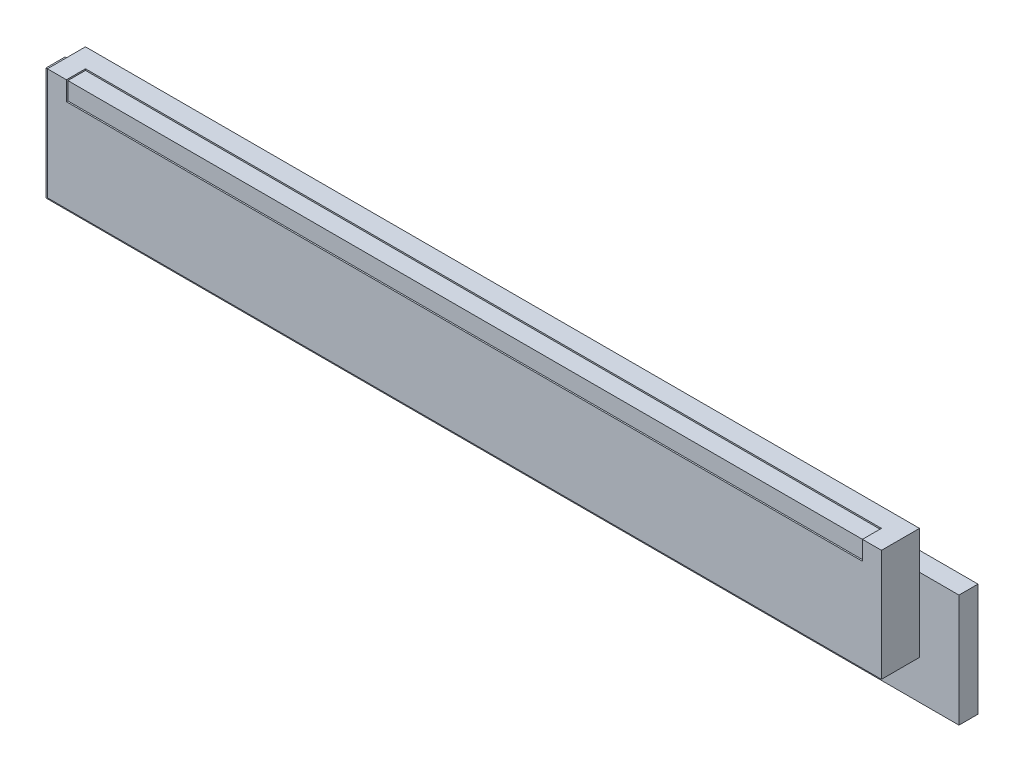
ISO-10303-21;
HEADER;
FILE_DESCRIPTION(('STEP AP214'),'2;1');
FILE_NAME('part.step','',(''),(''),'','','');
FILE_SCHEMA(('AUTOMOTIVE_DESIGN { 1 0 10303 214 1 1 1 1 }'));
ENDSEC;
DATA;
#1=APPLICATION_CONTEXT('core data for automotive mechanical design processes');
#2=APPLICATION_PROTOCOL_DEFINITION('international standard','automotive_design',2000,#1);
#3=PRODUCT_CONTEXT('',#1,'mechanical');
#4=PRODUCT('Part','Part','',(#3));
#5=PRODUCT_RELATED_PRODUCT_CATEGORY('part','',(#4));
#6=PRODUCT_DEFINITION_FORMATION('','',#4);
#7=PRODUCT_DEFINITION_CONTEXT('part definition',#1,'design');
#8=PRODUCT_DEFINITION('design','',#6,#7);
#9=PRODUCT_DEFINITION_SHAPE('','',#8);
#10=(LENGTH_UNIT() NAMED_UNIT(*) SI_UNIT(.MILLI.,.METRE.));
#11=(NAMED_UNIT(*) PLANE_ANGLE_UNIT() SI_UNIT($,.RADIAN.));
#12=(NAMED_UNIT(*) SI_UNIT($,.STERADIAN.) SOLID_ANGLE_UNIT());
#13=UNCERTAINTY_MEASURE_WITH_UNIT(LENGTH_MEASURE(1.E-05),#10,'distance_accuracy_value','');
#14=(GEOMETRIC_REPRESENTATION_CONTEXT(3) GLOBAL_UNCERTAINTY_ASSIGNED_CONTEXT((#13)) GLOBAL_UNIT_ASSIGNED_CONTEXT((#10,
#11,#12)) REPRESENTATION_CONTEXT('',''));
#15=CARTESIAN_POINT('',(0.,0.,0.));
#16=DIRECTION('',(0.,0.,1.));
#17=DIRECTION('',(1.,0.,0.));
#18=AXIS2_PLACEMENT_3D('',#15,#16,#17);
#19=CARTESIAN_POINT('',(-960.,198.5,120.));
#20=DIRECTION('',(0.,-1.,0.));
#21=DIRECTION('',(0.,0.,-1.));
#22=AXIS2_PLACEMENT_3D('',#19,#20,#21);
#23=PLANE('',#22);
#24=DIRECTION('',(-1.,0.,0.));
#25=VECTOR('',#24,1.);
#26=CARTESIAN_POINT('',(-960.,198.5,120.));
#27=LINE('',#26,#25);
#28=CARTESIAN_POINT('',(-837.,198.5,120.));
#29=VERTEX_POINT('',#28);
#30=CARTESIAN_POINT('',(-877.,198.5,120.));
#31=VERTEX_POINT('',#30);
#32=EDGE_CURVE('E251',#29,#31,#27,.T.);
#33=ORIENTED_EDGE('',*,*,#32,.F.);
#34=DIRECTION('',(0.,0.,1.));
#35=VECTOR('',#34,1.);
#36=CARTESIAN_POINT('',(-837.,198.5,120.));
#37=LINE('',#36,#35);
#38=CARTESIAN_POINT('',(-837.,198.5,80.));
#39=VERTEX_POINT('',#38);
#40=EDGE_CURVE('E183',#39,#29,#37,.T.);
#41=ORIENTED_EDGE('',*,*,#40,.F.);
#42=DIRECTION('',(1.,0.,0.));
#43=VECTOR('',#42,1.);
#44=CARTESIAN_POINT('',(-933.568542494924,198.5,80.));
#45=LINE('',#44,#43);
#46=CARTESIAN_POINT('',(837.,198.5,80.));
#47=VERTEX_POINT('',#46);
#48=EDGE_CURVE('E186',#39,#47,#45,.T.);
#49=ORIENTED_EDGE('',*,*,#48,.T.);
#50=DIRECTION('',(0.,0.,1.));
#51=VECTOR('',#50,1.);
#52=CARTESIAN_POINT('',(837.,198.5,120.));
#53=LINE('',#52,#51);
#54=CARTESIAN_POINT('',(837.,198.5,120.));
#55=VERTEX_POINT('',#54);
#56=EDGE_CURVE('E170',#47,#55,#53,.T.);
#57=ORIENTED_EDGE('',*,*,#56,.T.);
#58=CARTESIAN_POINT('',(877.,198.5,120.));
#59=VERTEX_POINT('',#58);
#60=EDGE_CURVE('E246',#59,#55,#27,.T.);
#61=ORIENTED_EDGE('',*,*,#60,.F.);
#62=DIRECTION('',(0.,0.,-1.));
#63=VECTOR('',#62,1.);
#64=CARTESIAN_POINT('',(877.,198.5,0.));
#65=LINE('',#64,#63);
#66=CARTESIAN_POINT('',(877.,198.5,40.));
#67=VERTEX_POINT('',#66);
#68=EDGE_CURVE('E204',#59,#67,#65,.T.);
#69=ORIENTED_EDGE('',*,*,#68,.T.);
#70=DIRECTION('',(-1.,0.,0.));
#71=VECTOR('',#70,1.);
#72=CARTESIAN_POINT('',(-960.,198.5,40.));
#73=LINE('',#72,#71);
#74=CARTESIAN_POINT('',(-877.,198.5,40.));
#75=VERTEX_POINT('',#74);
#76=EDGE_CURVE('E243',#67,#75,#73,.T.);
#77=ORIENTED_EDGE('',*,*,#76,.T.);
#78=DIRECTION('',(0.,0.,1.));
#79=VECTOR('',#78,1.);
#80=CARTESIAN_POINT('',(-877.,198.5,0.));
#81=LINE('',#80,#79);
#82=EDGE_CURVE('E205',#75,#31,#81,.T.);
#83=ORIENTED_EDGE('',*,*,#82,.T.);
#84=EDGE_LOOP('',(#33,#41,#49,#57,#61,#69,#77,#83));
#85=FACE_BOUND('',#84,.T.);
#86=ADVANCED_FACE('F40',(#85),#23,.F.);
#87=CARTESIAN_POINT('',(0.,0.,120.));
#88=DIRECTION('',(0.,0.,-1.));
#89=DIRECTION('',(-1.,0.,0.));
#90=AXIS2_PLACEMENT_3D('',#87,#88,#89);
#91=PLANE('',#90);
#92=DIRECTION('',(1.,0.,0.));
#93=VECTOR('',#92,1.);
#94=CARTESIAN_POINT('',(-933.568542494924,158.5,120.));
#95=LINE('',#94,#93);
#96=CARTESIAN_POINT('',(-837.,158.5,120.));
#97=VERTEX_POINT('',#96);
#98=CARTESIAN_POINT('',(837.,158.5,120.));
#99=VERTEX_POINT('',#98);
#100=EDGE_CURVE('E182',#97,#99,#95,.T.);
#101=ORIENTED_EDGE('',*,*,#100,.F.);
#102=DIRECTION('',(0.,-1.,0.));
#103=VECTOR('',#102,1.);
#104=CARTESIAN_POINT('',(-837.,158.5,120.));
#105=LINE('',#104,#103);
#106=EDGE_CURVE('E56',#29,#97,#105,.T.);
#107=ORIENTED_EDGE('',*,*,#106,.F.);
#108=ORIENTED_EDGE('',*,*,#32,.T.);
#109=DIRECTION('',(0.,1.,0.));
#110=VECTOR('',#109,1.);
#111=CARTESIAN_POINT('',(-877.,-118.5,120.));
#112=LINE('',#111,#110);
#113=CARTESIAN_POINT('',(-877.,-36.5,120.));
#114=VERTEX_POINT('',#113);
#115=EDGE_CURVE('E211',#114,#31,#112,.T.);
#116=ORIENTED_EDGE('',*,*,#115,.F.);
#117=DIRECTION('',(1.,0.,0.));
#118=VECTOR('',#117,1.);
#119=CARTESIAN_POINT('',(-960.,-36.5,120.));
#120=LINE('',#119,#118);
#121=CARTESIAN_POINT('',(877.,-36.5,120.));
#122=VERTEX_POINT('',#121);
#123=EDGE_CURVE('E229',#114,#122,#120,.T.);
#124=ORIENTED_EDGE('',*,*,#123,.T.);
#125=DIRECTION('',(0.,1.,0.));
#126=VECTOR('',#125,1.);
#127=CARTESIAN_POINT('',(877.,-118.5,120.));
#128=LINE('',#127,#126);
#129=EDGE_CURVE('E210',#122,#59,#128,.T.);
#130=ORIENTED_EDGE('',*,*,#129,.T.);
#131=ORIENTED_EDGE('',*,*,#60,.T.);
#132=DIRECTION('',(0.,-1.,0.));
#133=VECTOR('',#132,1.);
#134=CARTESIAN_POINT('',(837.,158.5,120.));
#135=LINE('',#134,#133);
#136=EDGE_CURVE('E178',#55,#99,#135,.T.);
#137=ORIENTED_EDGE('',*,*,#136,.T.);
#138=EDGE_LOOP('',(#101,#107,#108,#116,#124,#130,#131,#137));
#139=FACE_BOUND('',#138,.T.);
#140=ADVANCED_FACE('F318',(#139),#91,.F.);
#141=CARTESIAN_POINT('',(0.,0.,40.));
#142=DIRECTION('',(0.,0.,-1.));
#143=DIRECTION('',(-1.,0.,0.));
#144=AXIS2_PLACEMENT_3D('',#141,#142,#143);
#145=PLANE('',#144);
#146=DIRECTION('',(-1.,0.,0.));
#147=VECTOR('',#146,1.);
#148=CARTESIAN_POINT('',(-960.,118.5,40.));
#149=LINE('',#148,#147);
#150=CARTESIAN_POINT('',(877.,118.5,40.));
#151=VERTEX_POINT('',#150);
#152=CARTESIAN_POINT('',(-877.,118.5,40.));
#153=VERTEX_POINT('',#152);
#154=EDGE_CURVE('E259',#151,#153,#149,.T.);
#155=ORIENTED_EDGE('',*,*,#154,.T.);
#156=DIRECTION('',(0.,1.,0.));
#157=VECTOR('',#156,1.);
#158=CARTESIAN_POINT('',(-877.,-118.5,40.));
#159=LINE('',#158,#157);
#160=EDGE_CURVE('E209',#153,#75,#159,.T.);
#161=ORIENTED_EDGE('',*,*,#160,.T.);
#162=ORIENTED_EDGE('',*,*,#76,.F.);
#163=DIRECTION('',(0.,1.,0.));
#164=VECTOR('',#163,1.);
#165=CARTESIAN_POINT('',(877.,-118.5,40.));
#166=LINE('',#165,#164);
#167=EDGE_CURVE('E223',#151,#67,#166,.T.);
#168=ORIENTED_EDGE('',*,*,#167,.F.);
#169=EDGE_LOOP('',(#155,#161,#162,#168));
#170=FACE_BOUND('',#169,.T.);
#171=ADVANCED_FACE('F307',(#170),#145,.T.);
#172=CARTESIAN_POINT('',(-960.,-36.5,40.));
#173=DIRECTION('',(0.,1.,0.));
#174=DIRECTION('',(0.,0.,1.));
#175=AXIS2_PLACEMENT_3D('',#172,#173,#174);
#176=PLANE('',#175);
#177=DIRECTION('',(0.,0.,1.));
#178=VECTOR('',#177,1.);
#179=CARTESIAN_POINT('',(-877.,-36.5,40.));
#180=LINE('',#179,#178);
#181=CARTESIAN_POINT('',(-877.,-36.5,40.));
#182=VERTEX_POINT('',#181);
#183=EDGE_CURVE('E12',#182,#114,#180,.T.);
#184=ORIENTED_EDGE('',*,*,#183,.F.);
#185=DIRECTION('',(1.,0.,0.));
#186=VECTOR('',#185,1.);
#187=CARTESIAN_POINT('',(-960.,-36.5,40.));
#188=LINE('',#187,#186);
#189=CARTESIAN_POINT('',(876.999999999999,-36.5,40.));
#190=VERTEX_POINT('',#189);
#191=EDGE_CURVE('E215',#182,#190,#188,.T.);
#192=ORIENTED_EDGE('',*,*,#191,.T.);
#193=DIRECTION('',(0.,0.,-1.));
#194=VECTOR('',#193,1.);
#195=CARTESIAN_POINT('',(877.,-36.5,40.));
#196=LINE('',#195,#194);
#197=EDGE_CURVE('E49',#122,#190,#196,.T.);
#198=ORIENTED_EDGE('',*,*,#197,.F.);
#199=ORIENTED_EDGE('',*,*,#123,.F.);
#200=EDGE_LOOP('',(#184,#192,#198,#199));
#201=FACE_BOUND('',#200,.T.);
#202=ADVANCED_FACE('F295',(#201),#176,.F.);
#203=CARTESIAN_POINT('',(960.,118.5,40.));
#204=DIRECTION('',(-1.,0.,0.));
#205=DIRECTION('',(0.,0.,1.));
#206=AXIS2_PLACEMENT_3D('',#203,#204,#205);
#207=PLANE('',#206);
#208=DIRECTION('',(0.,0.,-1.));
#209=VECTOR('',#208,1.);
#210=CARTESIAN_POINT('',(960.,118.5,40.));
#211=LINE('',#210,#209);
#212=CARTESIAN_POINT('',(960.,118.5,40.));
#213=VERTEX_POINT('',#212);
#214=CARTESIAN_POINT('',(960.,118.5,0.));
#215=VERTEX_POINT('',#214);
#216=EDGE_CURVE('E284',#213,#215,#211,.T.);
#217=ORIENTED_EDGE('',*,*,#216,.F.);
#218=DIRECTION('',(0.,1.,0.));
#219=VECTOR('',#218,1.);
#220=CARTESIAN_POINT('',(960.,-118.5,40.));
#221=LINE('',#220,#219);
#222=CARTESIAN_POINT('',(960.,-118.5,40.));
#223=VERTEX_POINT('',#222);
#224=EDGE_CURVE('E233',#223,#213,#221,.T.);
#225=ORIENTED_EDGE('',*,*,#224,.F.);
#226=DIRECTION('',(0.,0.,-1.));
#227=VECTOR('',#226,1.);
#228=CARTESIAN_POINT('',(960.,-118.5,40.));
#229=LINE('',#228,#227);
#230=CARTESIAN_POINT('',(960.,-118.5,0.));
#231=VERTEX_POINT('',#230);
#232=EDGE_CURVE('E258',#223,#231,#229,.T.);
#233=ORIENTED_EDGE('',*,*,#232,.T.);
#234=DIRECTION('',(0.,1.,0.));
#235=VECTOR('',#234,1.);
#236=CARTESIAN_POINT('',(960.,118.5,0.));
#237=LINE('',#236,#235);
#238=EDGE_CURVE('E250',#231,#215,#237,.T.);
#239=ORIENTED_EDGE('',*,*,#238,.T.);
#240=EDGE_LOOP('',(#217,#225,#233,#239));
#241=FACE_BOUND('',#240,.T.);
#242=ADVANCED_FACE('F42',(#241),#207,.F.);
#243=CARTESIAN_POINT('',(-960.,118.5,40.));
#244=DIRECTION('',(0.,-1.,0.));
#245=DIRECTION('',(0.,0.,-1.));
#246=AXIS2_PLACEMENT_3D('',#243,#244,#245);
#247=PLANE('',#246);
#248=DIRECTION('',(-1.,0.,0.));
#249=VECTOR('',#248,1.);
#250=CARTESIAN_POINT('',(-960.,118.5,0.));
#251=LINE('',#250,#249);
#252=CARTESIAN_POINT('',(-960.,118.5,0.));
#253=VERTEX_POINT('',#252);
#254=EDGE_CURVE('E264',#215,#253,#251,.T.);
#255=ORIENTED_EDGE('',*,*,#254,.T.);
#256=DIRECTION('',(0.,0.,-1.));
#257=VECTOR('',#256,1.);
#258=CARTESIAN_POINT('',(-960.,118.5,40.));
#259=LINE('',#258,#257);
#260=CARTESIAN_POINT('',(-960.,118.5,40.));
#261=VERTEX_POINT('',#260);
#262=EDGE_CURVE('E280',#261,#253,#259,.T.);
#263=ORIENTED_EDGE('',*,*,#262,.F.);
#264=EDGE_CURVE('E260',#153,#261,#149,.T.);
#265=ORIENTED_EDGE('',*,*,#264,.F.);
#266=ORIENTED_EDGE('',*,*,#154,.F.);
#267=EDGE_CURVE('E255',#213,#151,#149,.T.);
#268=ORIENTED_EDGE('',*,*,#267,.F.);
#269=ORIENTED_EDGE('',*,*,#216,.T.);
#270=EDGE_LOOP('',(#255,#263,#265,#266,#268,#269));
#271=FACE_BOUND('',#270,.T.);
#272=ADVANCED_FACE('F372',(#271),#247,.F.);
#273=CARTESIAN_POINT('',(-960.,118.5,40.));
#274=DIRECTION('',(1.,0.,0.));
#275=DIRECTION('',(0.,0.,-1.));
#276=AXIS2_PLACEMENT_3D('',#273,#274,#275);
#277=PLANE('',#276);
#278=DIRECTION('',(0.,0.,-1.));
#279=VECTOR('',#278,1.);
#280=CARTESIAN_POINT('',(-960.,-118.5,40.));
#281=LINE('',#280,#279);
#282=CARTESIAN_POINT('',(-960.,-118.5,40.));
#283=VERTEX_POINT('',#282);
#284=CARTESIAN_POINT('',(-960.,-118.5,0.));
#285=VERTEX_POINT('',#284);
#286=EDGE_CURVE('E277',#283,#285,#281,.T.);
#287=ORIENTED_EDGE('',*,*,#286,.F.);
#288=DIRECTION('',(0.,1.,0.));
#289=VECTOR('',#288,1.);
#290=CARTESIAN_POINT('',(-960.,-118.5,40.));
#291=LINE('',#290,#289);
#292=EDGE_CURVE('E240',#283,#261,#291,.T.);
#293=ORIENTED_EDGE('',*,*,#292,.T.);
#294=ORIENTED_EDGE('',*,*,#262,.T.);
#295=DIRECTION('',(0.,-1.,0.));
#296=VECTOR('',#295,1.);
#297=CARTESIAN_POINT('',(-960.,118.5,0.));
#298=LINE('',#297,#296);
#299=EDGE_CURVE('E267',#253,#285,#298,.T.);
#300=ORIENTED_EDGE('',*,*,#299,.T.);
#301=EDGE_LOOP('',(#287,#293,#294,#300));
#302=FACE_BOUND('',#301,.T.);
#303=ADVANCED_FACE('F369',(#302),#277,.F.);
#304=CARTESIAN_POINT('',(-960.,-118.5,40.));
#305=DIRECTION('',(0.,1.,0.));
#306=DIRECTION('',(0.,0.,1.));
#307=AXIS2_PLACEMENT_3D('',#304,#305,#306);
#308=PLANE('',#307);
#309=ORIENTED_EDGE('',*,*,#232,.F.);
#310=DIRECTION('',(-1.,0.,0.));
#311=VECTOR('',#310,1.);
#312=CARTESIAN_POINT('',(-937.,-118.5,40.));
#313=LINE('',#312,#311);
#314=EDGE_CURVE('E237',#223,#283,#313,.T.);
#315=ORIENTED_EDGE('',*,*,#314,.T.);
#316=ORIENTED_EDGE('',*,*,#286,.T.);
#317=DIRECTION('',(1.,0.,0.));
#318=VECTOR('',#317,1.);
#319=CARTESIAN_POINT('',(-960.,-118.5,0.));
#320=LINE('',#319,#318);
#321=EDGE_CURVE('E271',#285,#231,#320,.T.);
#322=ORIENTED_EDGE('',*,*,#321,.T.);
#323=EDGE_LOOP('',(#309,#315,#316,#322));
#324=FACE_BOUND('',#323,.T.);
#325=ADVANCED_FACE('F365',(#324),#308,.F.);
#326=CARTESIAN_POINT('',(0.,0.,0.));
#327=DIRECTION('',(0.,0.,1.));
#328=DIRECTION('',(1.,0.,0.));
#329=AXIS2_PLACEMENT_3D('',#326,#327,#328);
#330=PLANE('',#329);
#331=ORIENTED_EDGE('',*,*,#238,.F.);
#332=ORIENTED_EDGE('',*,*,#321,.F.);
#333=ORIENTED_EDGE('',*,*,#299,.F.);
#334=ORIENTED_EDGE('',*,*,#254,.F.);
#335=EDGE_LOOP('',(#331,#332,#333,#334));
#336=FACE_BOUND('',#335,.T.);
#337=ADVANCED_FACE('F362',(#336),#330,.F.);
#338=CARTESIAN_POINT('',(-937.,-118.5,40.));
#339=DIRECTION('',(0.,0.,-1.));
#340=DIRECTION('',(-1.,0.,0.));
#341=AXIS2_PLACEMENT_3D('',#338,#339,#340);
#342=PLANE('',#341);
#343=ORIENTED_EDGE('',*,*,#267,.T.);
#344=EDGE_CURVE('E64',#190,#151,#166,.T.);
#345=ORIENTED_EDGE('',*,*,#344,.F.);
#346=ORIENTED_EDGE('',*,*,#191,.F.);
#347=EDGE_CURVE('E216',#182,#153,#159,.T.);
#348=ORIENTED_EDGE('',*,*,#347,.T.);
#349=ORIENTED_EDGE('',*,*,#264,.T.);
#350=ORIENTED_EDGE('',*,*,#292,.F.);
#351=ORIENTED_EDGE('',*,*,#314,.F.);
#352=ORIENTED_EDGE('',*,*,#224,.T.);
#353=EDGE_LOOP('',(#343,#345,#346,#348,#349,#350,#351,#352));
#354=FACE_BOUND('',#353,.T.);
#355=ADVANCED_FACE('F297',(#354),#342,.F.);
#356=CARTESIAN_POINT('',(877.,-118.5,0.));
#357=DIRECTION('',(1.,0.,0.));
#358=DIRECTION('',(0.,0.,-1.));
#359=AXIS2_PLACEMENT_3D('',#356,#357,#358);
#360=PLANE('',#359);
#361=ORIENTED_EDGE('',*,*,#197,.T.);
#362=ORIENTED_EDGE('',*,*,#344,.T.);
#363=ORIENTED_EDGE('',*,*,#167,.T.);
#364=ORIENTED_EDGE('',*,*,#68,.F.);
#365=ORIENTED_EDGE('',*,*,#129,.F.);
#366=EDGE_LOOP('',(#361,#362,#363,#364,#365));
#367=FACE_BOUND('',#366,.T.);
#368=ADVANCED_FACE('F290',(#367),#360,.T.);
#369=CARTESIAN_POINT('',(-877.,-118.5,0.));
#370=DIRECTION('',(-1.,0.,0.));
#371=DIRECTION('',(0.,0.,1.));
#372=AXIS2_PLACEMENT_3D('',#369,#370,#371);
#373=PLANE('',#372);
#374=ORIENTED_EDGE('',*,*,#183,.T.);
#375=ORIENTED_EDGE('',*,*,#115,.T.);
#376=ORIENTED_EDGE('',*,*,#82,.F.);
#377=ORIENTED_EDGE('',*,*,#160,.F.);
#378=ORIENTED_EDGE('',*,*,#347,.F.);
#379=EDGE_LOOP('',(#374,#375,#376,#377,#378));
#380=FACE_BOUND('',#379,.T.);
#381=ADVANCED_FACE('F321',(#380),#373,.T.);
#382=CARTESIAN_POINT('',(-837.,-118.5,0.));
#383=DIRECTION('',(-1.,0.,0.));
#384=DIRECTION('',(0.,0.,1.));
#385=AXIS2_PLACEMENT_3D('',#382,#383,#384);
#386=PLANE('',#385);
#387=ORIENTED_EDGE('',*,*,#106,.T.);
#388=DIRECTION('',(0.,0.,-1.));
#389=VECTOR('',#388,1.);
#390=CARTESIAN_POINT('',(-837.,158.5,120.));
#391=LINE('',#390,#389);
#392=CARTESIAN_POINT('',(-837.,158.5,117.));
#393=VERTEX_POINT('',#392);
#394=EDGE_CURVE('E162',#97,#393,#391,.T.);
#395=ORIENTED_EDGE('',*,*,#394,.T.);
#396=DIRECTION('',(0.,1.,0.));
#397=VECTOR('',#396,1.);
#398=CARTESIAN_POINT('',(-837.,158.5,117.));
#399=LINE('',#398,#397);
#400=CARTESIAN_POINT('',(-837.,195.5,117.));
#401=VERTEX_POINT('',#400);
#402=EDGE_CURVE('E149',#393,#401,#399,.T.);
#403=ORIENTED_EDGE('',*,*,#402,.T.);
#404=DIRECTION('',(0.,0.,-1.));
#405=VECTOR('',#404,1.);
#406=CARTESIAN_POINT('',(-837.,195.5,117.));
#407=LINE('',#406,#405);
#408=CARTESIAN_POINT('',(-837.,195.5,80.));
#409=VERTEX_POINT('',#408);
#410=EDGE_CURVE('E192',#401,#409,#407,.T.);
#411=ORIENTED_EDGE('',*,*,#410,.T.);
#412=DIRECTION('',(0.,1.,0.));
#413=VECTOR('',#412,1.);
#414=CARTESIAN_POINT('',(-837.,195.5,80.));
#415=LINE('',#414,#413);
#416=EDGE_CURVE('E187',#409,#39,#415,.T.);
#417=ORIENTED_EDGE('',*,*,#416,.T.);
#418=ORIENTED_EDGE('',*,*,#40,.T.);
#419=EDGE_LOOP('',(#387,#395,#403,#411,#417,#418));
#420=FACE_BOUND('',#419,.T.);
#421=ADVANCED_FACE('F168',(#420),#386,.F.);
#422=CARTESIAN_POINT('',(837.,0.,0.));
#423=DIRECTION('',(-1.,0.,0.));
#424=DIRECTION('',(0.,0.,1.));
#425=AXIS2_PLACEMENT_3D('',#422,#423,#424);
#426=PLANE('',#425);
#427=ORIENTED_EDGE('',*,*,#136,.F.);
#428=ORIENTED_EDGE('',*,*,#56,.F.);
#429=DIRECTION('',(0.,1.,0.));
#430=VECTOR('',#429,1.);
#431=CARTESIAN_POINT('',(837.,195.5,80.));
#432=LINE('',#431,#430);
#433=CARTESIAN_POINT('',(837.,195.5,80.));
#434=VERTEX_POINT('',#433);
#435=EDGE_CURVE('E174',#434,#47,#432,.T.);
#436=ORIENTED_EDGE('',*,*,#435,.F.);
#437=DIRECTION('',(0.,0.,-1.));
#438=VECTOR('',#437,1.);
#439=CARTESIAN_POINT('',(837.,195.5,117.));
#440=LINE('',#439,#438);
#441=CARTESIAN_POINT('',(837.,195.5,117.));
#442=VERTEX_POINT('',#441);
#443=EDGE_CURVE('E330',#442,#434,#440,.T.);
#444=ORIENTED_EDGE('',*,*,#443,.F.);
#445=DIRECTION('',(0.,1.,0.));
#446=VECTOR('',#445,1.);
#447=CARTESIAN_POINT('',(837.,158.5,117.));
#448=LINE('',#447,#446);
#449=CARTESIAN_POINT('',(837.,158.5,117.));
#450=VERTEX_POINT('',#449);
#451=EDGE_CURVE('E328',#450,#442,#448,.T.);
#452=ORIENTED_EDGE('',*,*,#451,.F.);
#453=DIRECTION('',(0.,0.,-1.));
#454=VECTOR('',#453,1.);
#455=CARTESIAN_POINT('',(837.,158.5,120.));
#456=LINE('',#455,#454);
#457=EDGE_CURVE('E165',#99,#450,#456,.T.);
#458=ORIENTED_EDGE('',*,*,#457,.F.);
#459=EDGE_LOOP('',(#427,#428,#436,#444,#452,#458));
#460=FACE_BOUND('',#459,.T.);
#461=ADVANCED_FACE('F342',(#460),#426,.T.);
#462=CARTESIAN_POINT('',(-933.568542494924,158.5,120.));
#463=DIRECTION('',(0.,-1.,0.));
#464=DIRECTION('',(0.,0.,-1.));
#465=AXIS2_PLACEMENT_3D('',#462,#463,#464);
#466=PLANE('',#465);
#467=ORIENTED_EDGE('',*,*,#100,.T.);
#468=ORIENTED_EDGE('',*,*,#457,.T.);
#469=DIRECTION('',(1.,0.,0.));
#470=VECTOR('',#469,1.);
#471=CARTESIAN_POINT('',(-933.568542494924,158.5,117.));
#472=LINE('',#471,#470);
#473=EDGE_CURVE('E153',#393,#450,#472,.T.);
#474=ORIENTED_EDGE('',*,*,#473,.F.);
#475=ORIENTED_EDGE('',*,*,#394,.F.);
#476=EDGE_LOOP('',(#467,#468,#474,#475));
#477=FACE_BOUND('',#476,.T.);
#478=ADVANCED_FACE('F161',(#477),#466,.F.);
#479=CARTESIAN_POINT('',(-933.568542494924,158.5,117.));
#480=DIRECTION('',(0.,0.,-1.));
#481=DIRECTION('',(-1.,0.,0.));
#482=AXIS2_PLACEMENT_3D('',#479,#480,#481);
#483=PLANE('',#482);
#484=ORIENTED_EDGE('',*,*,#473,.T.);
#485=ORIENTED_EDGE('',*,*,#451,.T.);
#486=DIRECTION('',(1.,0.,0.));
#487=VECTOR('',#486,1.);
#488=CARTESIAN_POINT('',(-933.568542494924,195.5,117.));
#489=LINE('',#488,#487);
#490=EDGE_CURVE('E155',#401,#442,#489,.T.);
#491=ORIENTED_EDGE('',*,*,#490,.F.);
#492=ORIENTED_EDGE('',*,*,#402,.F.);
#493=EDGE_LOOP('',(#484,#485,#491,#492));
#494=FACE_BOUND('',#493,.T.);
#495=ADVANCED_FACE('F151',(#494),#483,.F.);
#496=CARTESIAN_POINT('',(-933.568542494924,195.5,117.));
#497=DIRECTION('',(0.,-1.,0.));
#498=DIRECTION('',(0.,0.,-1.));
#499=AXIS2_PLACEMENT_3D('',#496,#497,#498);
#500=PLANE('',#499);
#501=ORIENTED_EDGE('',*,*,#490,.T.);
#502=ORIENTED_EDGE('',*,*,#443,.T.);
#503=DIRECTION('',(1.,0.,0.));
#504=VECTOR('',#503,1.);
#505=CARTESIAN_POINT('',(-933.568542494924,195.5,80.));
#506=LINE('',#505,#504);
#507=EDGE_CURVE('E191',#409,#434,#506,.T.);
#508=ORIENTED_EDGE('',*,*,#507,.F.);
#509=ORIENTED_EDGE('',*,*,#410,.F.);
#510=EDGE_LOOP('',(#501,#502,#508,#509));
#511=FACE_BOUND('',#510,.T.);
#512=ADVANCED_FACE('F344',(#511),#500,.F.);
#513=CARTESIAN_POINT('',(-933.568542494924,195.5,80.));
#514=DIRECTION('',(0.,0.,-1.));
#515=DIRECTION('',(-1.,0.,0.));
#516=AXIS2_PLACEMENT_3D('',#513,#514,#515);
#517=PLANE('',#516);
#518=ORIENTED_EDGE('',*,*,#507,.T.);
#519=ORIENTED_EDGE('',*,*,#435,.T.);
#520=ORIENTED_EDGE('',*,*,#48,.F.);
#521=ORIENTED_EDGE('',*,*,#416,.F.);
#522=EDGE_LOOP('',(#518,#519,#520,#521));
#523=FACE_BOUND('',#522,.T.);
#524=ADVANCED_FACE('F339',(#523),#517,.F.);
#525=CLOSED_SHELL('',(#86,#140,#171,#202,#242,#272,#303,#325,#337,#355,#368,#381,#421,#461,#478,
#495,#512,#524));
#526=MANIFOLD_SOLID_BREP('B2',#525);
#527=ADVANCED_BREP_SHAPE_REPRESENTATION('',(#18,#526),#14);
#528=SHAPE_DEFINITION_REPRESENTATION(#9,#527);
ENDSEC;
END-ISO-10303-21;
